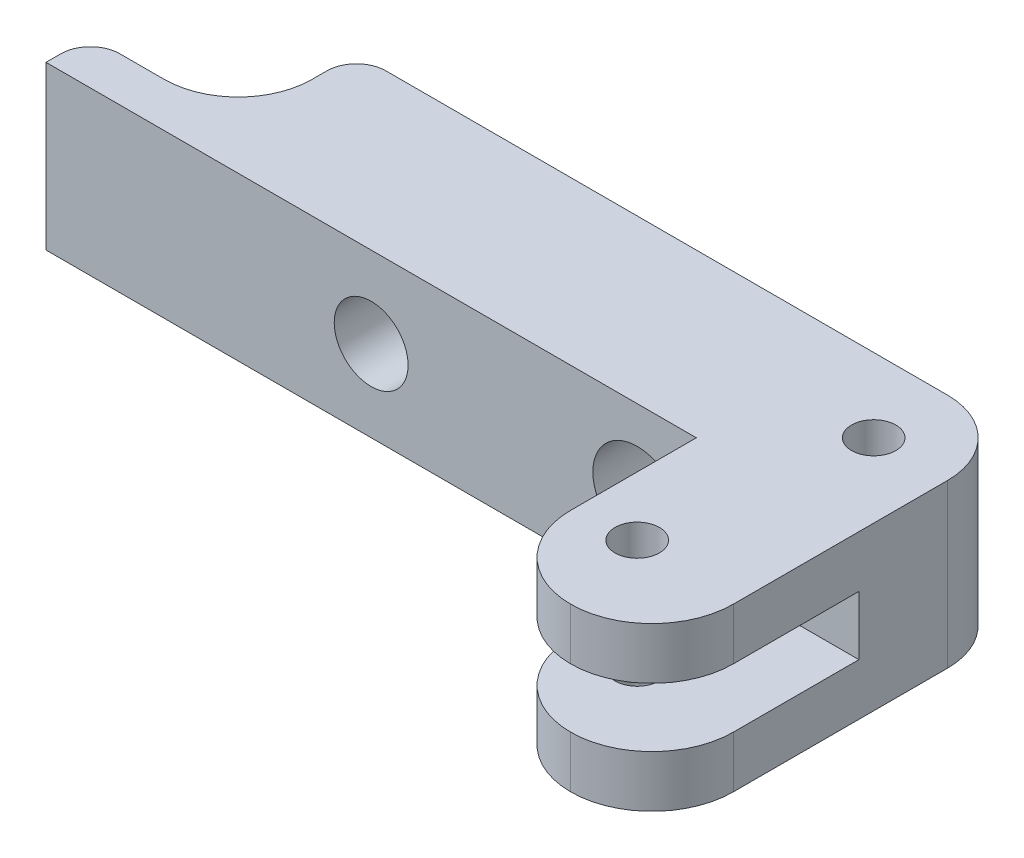
ISO-10303-21;
HEADER;
FILE_DESCRIPTION(('STEP AP214'),'2;1');
FILE_NAME('part.step','',(''),(''),'','','');
FILE_SCHEMA(('AUTOMOTIVE_DESIGN { 1 0 10303 214 1 1 1 1 }'));
ENDSEC;
DATA;
#1=APPLICATION_CONTEXT('core data for automotive mechanical design processes');
#2=APPLICATION_PROTOCOL_DEFINITION('international standard','automotive_design',2000,#1);
#3=PRODUCT_CONTEXT('',#1,'mechanical');
#4=PRODUCT('Part','Part','',(#3));
#5=PRODUCT_RELATED_PRODUCT_CATEGORY('part','',(#4));
#6=PRODUCT_DEFINITION_FORMATION('','',#4);
#7=PRODUCT_DEFINITION_CONTEXT('part definition',#1,'design');
#8=PRODUCT_DEFINITION('design','',#6,#7);
#9=PRODUCT_DEFINITION_SHAPE('','',#8);
#10=(LENGTH_UNIT() NAMED_UNIT(*) SI_UNIT(.MILLI.,.METRE.));
#11=(NAMED_UNIT(*) PLANE_ANGLE_UNIT() SI_UNIT($,.RADIAN.));
#12=(NAMED_UNIT(*) SI_UNIT($,.STERADIAN.) SOLID_ANGLE_UNIT());
#13=UNCERTAINTY_MEASURE_WITH_UNIT(LENGTH_MEASURE(1.E-05),#10,'distance_accuracy_value','');
#14=(GEOMETRIC_REPRESENTATION_CONTEXT(3) GLOBAL_UNCERTAINTY_ASSIGNED_CONTEXT((#13)) GLOBAL_UNIT_ASSIGNED_CONTEXT((#10,
#11,#12)) REPRESENTATION_CONTEXT('',''));
#15=CARTESIAN_POINT('',(0.,0.,0.));
#16=DIRECTION('',(0.,0.,1.));
#17=DIRECTION('',(1.,0.,0.));
#18=AXIS2_PLACEMENT_3D('',#15,#16,#17);
#19=CARTESIAN_POINT('',(49.5,11.,8.5));
#20=DIRECTION('',(0.,-1.,0.));
#21=DIRECTION('',(0.,0.,-1.));
#22=AXIS2_PLACEMENT_3D('',#19,#20,#21);
#23=CYLINDRICAL_SURFACE('',#22,5.5);
#24=CARTESIAN_POINT('',(49.5,7.5,8.5));
#25=DIRECTION('',(0.,1.,0.));
#26=DIRECTION('',(0.,0.,1.));
#27=AXIS2_PLACEMENT_3D('',#24,#25,#26);
#28=CIRCLE('',#27,5.5);
#29=CARTESIAN_POINT('',(55.,7.5,8.5));
#30=VERTEX_POINT('',#29);
#31=CARTESIAN_POINT('',(49.5,7.5,14.));
#32=VERTEX_POINT('',#31);
#33=EDGE_CURVE('E193',#30,#32,#28,.F.);
#34=ORIENTED_EDGE('',*,*,#33,.F.);
#35=DIRECTION('',(0.,-1.,0.));
#36=VECTOR('',#35,1.);
#37=CARTESIAN_POINT('',(55.,11.,8.5));
#38=LINE('',#37,#36);
#39=CARTESIAN_POINT('',(55.,11.,8.5));
#40=VERTEX_POINT('',#39);
#41=EDGE_CURVE('E289',#40,#30,#38,.T.);
#42=ORIENTED_EDGE('',*,*,#41,.F.);
#43=CARTESIAN_POINT('',(49.5,11.,8.5));
#44=DIRECTION('',(0.,-1.,0.));
#45=DIRECTION('',(0.,0.,-1.));
#46=AXIS2_PLACEMENT_3D('',#43,#44,#45);
#47=CIRCLE('',#46,5.5);
#48=CARTESIAN_POINT('',(49.5,11.,14.));
#49=VERTEX_POINT('',#48);
#50=EDGE_CURVE('E58',#49,#40,#47,.F.);
#51=ORIENTED_EDGE('',*,*,#50,.F.);
#52=DIRECTION('',(0.,1.,0.));
#53=VECTOR('',#52,1.);
#54=CARTESIAN_POINT('',(49.5,11.,14.));
#55=LINE('',#54,#53);
#56=EDGE_CURVE('E281',#49,#32,#55,.F.);
#57=ORIENTED_EDGE('',*,*,#56,.T.);
#58=EDGE_LOOP('',(#34,#42,#51,#57));
#59=FACE_BOUND('',#58,.T.);
#60=ADVANCED_FACE('F33',(#59),#23,.T.);
#61=CARTESIAN_POINT('',(49.5,11.,8.5));
#62=DIRECTION('',(0.,1.,0.));
#63=DIRECTION('',(0.,0.,1.));
#64=AXIS2_PLACEMENT_3D('',#61,#62,#63);
#65=CYLINDRICAL_SURFACE('',#64,5.5);
#66=CARTESIAN_POINT('',(49.5,7.5,8.5));
#67=DIRECTION('',(0.,1.,0.));
#68=DIRECTION('',(0.,0.,1.));
#69=AXIS2_PLACEMENT_3D('',#66,#67,#68);
#70=CIRCLE('',#69,5.5);
#71=CARTESIAN_POINT('',(44.,7.5,8.5));
#72=VERTEX_POINT('',#71);
#73=EDGE_CURVE('E191',#32,#72,#70,.F.);
#74=ORIENTED_EDGE('',*,*,#73,.F.);
#75=ORIENTED_EDGE('',*,*,#56,.F.);
#76=CARTESIAN_POINT('',(49.5,11.,8.5));
#77=DIRECTION('',(0.,-1.,0.));
#78=DIRECTION('',(0.,0.,-1.));
#79=AXIS2_PLACEMENT_3D('',#76,#77,#78);
#80=CIRCLE('',#79,5.5);
#81=CARTESIAN_POINT('',(44.,11.,8.5));
#82=VERTEX_POINT('',#81);
#83=EDGE_CURVE('E286',#82,#49,#80,.F.);
#84=ORIENTED_EDGE('',*,*,#83,.F.);
#85=DIRECTION('',(0.,1.,0.));
#86=VECTOR('',#85,1.);
#87=CARTESIAN_POINT('',(44.,11.,8.5));
#88=LINE('',#87,#86);
#89=EDGE_CURVE('E276',#72,#82,#88,.T.);
#90=ORIENTED_EDGE('',*,*,#89,.F.);
#91=EDGE_LOOP('',(#74,#75,#84,#90));
#92=FACE_BOUND('',#91,.T.);
#93=ADVANCED_FACE('F393',(#92),#65,.T.);
#94=CARTESIAN_POINT('',(44.,11.,14.));
#95=DIRECTION('',(1.,0.,0.));
#96=DIRECTION('',(0.,0.,-1.));
#97=AXIS2_PLACEMENT_3D('',#94,#95,#96);
#98=PLANE('',#97);
#99=DIRECTION('',(0.,-1.,0.));
#100=VECTOR('',#99,1.);
#101=CARTESIAN_POINT('',(44.,11.,0.));
#102=LINE('',#101,#100);
#103=CARTESIAN_POINT('',(44.,11.,0.));
#104=VERTEX_POINT('',#103);
#105=CARTESIAN_POINT('',(44.,7.5,0.));
#106=VERTEX_POINT('',#105);
#107=EDGE_CURVE('E229',#104,#106,#102,.T.);
#108=ORIENTED_EDGE('',*,*,#107,.T.);
#109=DIRECTION('',(0.,0.,-1.));
#110=VECTOR('',#109,1.);
#111=CARTESIAN_POINT('',(44.,7.5,0.));
#112=LINE('',#111,#110);
#113=EDGE_CURVE('E178',#72,#106,#112,.T.);
#114=ORIENTED_EDGE('',*,*,#113,.F.);
#115=ORIENTED_EDGE('',*,*,#89,.T.);
#116=DIRECTION('',(0.,0.,1.));
#117=VECTOR('',#116,1.);
#118=CARTESIAN_POINT('',(44.,11.,14.));
#119=LINE('',#118,#117);
#120=EDGE_CURVE('E199',#104,#82,#119,.T.);
#121=ORIENTED_EDGE('',*,*,#120,.F.);
#122=EDGE_LOOP('',(#108,#114,#115,#121));
#123=FACE_BOUND('',#122,.T.);
#124=ADVANCED_FACE('F396',(#123),#98,.F.);
#125=CARTESIAN_POINT('',(49.5,3.5,8.5));
#126=DIRECTION('',(0.,-1.,0.));
#127=DIRECTION('',(0.,0.,-1.));
#128=AXIS2_PLACEMENT_3D('',#125,#126,#127);
#129=CIRCLE('',#128,5.5);
#130=CARTESIAN_POINT('',(49.5,3.5,14.));
#131=VERTEX_POINT('',#130);
#132=CARTESIAN_POINT('',(55.,3.5,8.5));
#133=VERTEX_POINT('',#132);
#134=EDGE_CURVE('E50',#131,#133,#129,.F.);
#135=ORIENTED_EDGE('',*,*,#134,.F.);
#136=CARTESIAN_POINT('',(49.5,0.,14.));
#137=VERTEX_POINT('',#136);
#138=EDGE_CURVE('E280',#131,#137,#55,.F.);
#139=ORIENTED_EDGE('',*,*,#138,.T.);
#140=CARTESIAN_POINT('',(49.5,0.,8.5));
#141=DIRECTION('',(0.,-1.,0.));
#142=DIRECTION('',(0.,0.,-1.));
#143=AXIS2_PLACEMENT_3D('',#140,#141,#142);
#144=CIRCLE('',#143,5.5);
#145=CARTESIAN_POINT('',(55.,0.,8.5));
#146=VERTEX_POINT('',#145);
#147=EDGE_CURVE('E42',#146,#137,#144,.T.);
#148=ORIENTED_EDGE('',*,*,#147,.F.);
#149=EDGE_CURVE('E288',#133,#146,#38,.T.);
#150=ORIENTED_EDGE('',*,*,#149,.F.);
#151=EDGE_LOOP('',(#135,#139,#148,#150));
#152=FACE_BOUND('',#151,.T.);
#153=ADVANCED_FACE('F35',(#152),#23,.T.);
#154=CARTESIAN_POINT('',(49.5,3.5,8.5));
#155=DIRECTION('',(0.,-1.,0.));
#156=DIRECTION('',(0.,0.,-1.));
#157=AXIS2_PLACEMENT_3D('',#154,#155,#156);
#158=CIRCLE('',#157,5.5);
#159=CARTESIAN_POINT('',(44.,3.5,8.5));
#160=VERTEX_POINT('',#159);
#161=EDGE_CURVE('E187',#160,#131,#158,.F.);
#162=ORIENTED_EDGE('',*,*,#161,.F.);
#163=CARTESIAN_POINT('',(44.,0.,8.5));
#164=VERTEX_POINT('',#163);
#165=EDGE_CURVE('E277',#164,#160,#88,.T.);
#166=ORIENTED_EDGE('',*,*,#165,.F.);
#167=CARTESIAN_POINT('',(49.5,0.,8.5));
#168=DIRECTION('',(0.,-1.,0.));
#169=DIRECTION('',(0.,0.,-1.));
#170=AXIS2_PLACEMENT_3D('',#167,#168,#169);
#171=CIRCLE('',#170,5.5);
#172=EDGE_CURVE('E284',#137,#164,#171,.T.);
#173=ORIENTED_EDGE('',*,*,#172,.F.);
#174=ORIENTED_EDGE('',*,*,#138,.F.);
#175=EDGE_LOOP('',(#162,#166,#173,#174));
#176=FACE_BOUND('',#175,.T.);
#177=ADVANCED_FACE('F343',(#176),#65,.T.);
#178=CARTESIAN_POINT('',(50.,11.,-6.));
#179=DIRECTION('',(0.,-1.,0.));
#180=DIRECTION('',(0.,0.,-1.));
#181=AXIS2_PLACEMENT_3D('',#178,#179,#180);
#182=CYLINDRICAL_SURFACE('',#181,5.);
#183=DIRECTION('',(0.,-1.,0.));
#184=VECTOR('',#183,1.);
#185=CARTESIAN_POINT('',(50.,11.,-11.));
#186=LINE('',#185,#184);
#187=CARTESIAN_POINT('',(50.,11.,-11.));
#188=VERTEX_POINT('',#187);
#189=CARTESIAN_POINT('',(50.,0.,-11.));
#190=VERTEX_POINT('',#189);
#191=EDGE_CURVE('E265',#188,#190,#186,.T.);
#192=ORIENTED_EDGE('',*,*,#191,.F.);
#193=CARTESIAN_POINT('',(50.,11.,-6.));
#194=DIRECTION('',(0.,-1.,0.));
#195=DIRECTION('',(0.,0.,-1.));
#196=AXIS2_PLACEMENT_3D('',#193,#194,#195);
#197=CIRCLE('',#196,5.);
#198=CARTESIAN_POINT('',(55.,11.,-6.));
#199=VERTEX_POINT('',#198);
#200=EDGE_CURVE('E271',#199,#188,#197,.F.);
#201=ORIENTED_EDGE('',*,*,#200,.F.);
#202=DIRECTION('',(0.,-1.,0.));
#203=VECTOR('',#202,1.);
#204=CARTESIAN_POINT('',(55.,11.,-6.));
#205=LINE('',#204,#203);
#206=CARTESIAN_POINT('',(55.,0.,-6.));
#207=VERTEX_POINT('',#206);
#208=EDGE_CURVE('E268',#207,#199,#205,.F.);
#209=ORIENTED_EDGE('',*,*,#208,.F.);
#210=CARTESIAN_POINT('',(50.,0.,-6.));
#211=DIRECTION('',(0.,-1.,0.));
#212=DIRECTION('',(0.,0.,-1.));
#213=AXIS2_PLACEMENT_3D('',#210,#211,#212);
#214=CIRCLE('',#213,5.);
#215=EDGE_CURVE('E273',#190,#207,#214,.T.);
#216=ORIENTED_EDGE('',*,*,#215,.F.);
#217=EDGE_LOOP('',(#192,#201,#209,#216));
#218=FACE_BOUND('',#217,.T.);
#219=ADVANCED_FACE('F384',(#218),#182,.T.);
#220=CARTESIAN_POINT('',(12.,11.,-9.));
#221=DIRECTION('',(0.,-1.,0.));
#222=DIRECTION('',(0.,0.,-1.));
#223=AXIS2_PLACEMENT_3D('',#220,#221,#222);
#224=CYLINDRICAL_SURFACE('',#223,2.);
#225=DIRECTION('',(0.,-1.,0.));
#226=VECTOR('',#225,1.);
#227=CARTESIAN_POINT('',(10.,11.,-9.));
#228=LINE('',#227,#226);
#229=CARTESIAN_POINT('',(10.,11.,-9.));
#230=VERTEX_POINT('',#229);
#231=CARTESIAN_POINT('',(10.,0.,-9.));
#232=VERTEX_POINT('',#231);
#233=EDGE_CURVE('E254',#230,#232,#228,.T.);
#234=ORIENTED_EDGE('',*,*,#233,.F.);
#235=CARTESIAN_POINT('',(12.,11.,-9.));
#236=DIRECTION('',(0.,-1.,0.));
#237=DIRECTION('',(0.,0.,-1.));
#238=AXIS2_PLACEMENT_3D('',#235,#236,#237);
#239=CIRCLE('',#238,2.);
#240=CARTESIAN_POINT('',(12.,11.,-11.));
#241=VERTEX_POINT('',#240);
#242=EDGE_CURVE('E260',#241,#230,#239,.F.);
#243=ORIENTED_EDGE('',*,*,#242,.F.);
#244=DIRECTION('',(0.,-1.,0.));
#245=VECTOR('',#244,1.);
#246=CARTESIAN_POINT('',(12.,11.,-11.));
#247=LINE('',#246,#245);
#248=CARTESIAN_POINT('',(12.,0.,-11.));
#249=VERTEX_POINT('',#248);
#250=EDGE_CURVE('E257',#249,#241,#247,.F.);
#251=ORIENTED_EDGE('',*,*,#250,.F.);
#252=CARTESIAN_POINT('',(12.,0.,-9.));
#253=DIRECTION('',(0.,-1.,0.));
#254=DIRECTION('',(0.,0.,-1.));
#255=AXIS2_PLACEMENT_3D('',#252,#253,#254);
#256=CIRCLE('',#255,2.);
#257=EDGE_CURVE('E262',#232,#249,#256,.T.);
#258=ORIENTED_EDGE('',*,*,#257,.F.);
#259=EDGE_LOOP('',(#234,#243,#251,#258));
#260=FACE_BOUND('',#259,.T.);
#261=ADVANCED_FACE('F377',(#260),#224,.T.);
#262=CARTESIAN_POINT('',(5.,11.,-8.));
#263=DIRECTION('',(0.,1.,0.));
#264=DIRECTION('',(0.,0.,1.));
#265=AXIS2_PLACEMENT_3D('',#262,#263,#264);
#266=CYLINDRICAL_SURFACE('',#265,5.);
#267=DIRECTION('',(0.,-1.,0.));
#268=VECTOR('',#267,1.);
#269=CARTESIAN_POINT('',(5.,11.,-3.));
#270=LINE('',#269,#268);
#271=CARTESIAN_POINT('',(5.,11.,-3.));
#272=VERTEX_POINT('',#271);
#273=CARTESIAN_POINT('',(5.,0.,-3.));
#274=VERTEX_POINT('',#273);
#275=EDGE_CURVE('E243',#272,#274,#270,.T.);
#276=ORIENTED_EDGE('',*,*,#275,.F.);
#277=CARTESIAN_POINT('',(5.,11.,-8.));
#278=DIRECTION('',(0.,-1.,0.));
#279=DIRECTION('',(0.,0.,-1.));
#280=AXIS2_PLACEMENT_3D('',#277,#278,#279);
#281=CIRCLE('',#280,5.);
#282=CARTESIAN_POINT('',(10.,11.,-8.));
#283=VERTEX_POINT('',#282);
#284=EDGE_CURVE('E249',#272,#283,#281,.F.);
#285=ORIENTED_EDGE('',*,*,#284,.T.);
#286=DIRECTION('',(0.,-1.,0.));
#287=VECTOR('',#286,1.);
#288=CARTESIAN_POINT('',(10.,11.,-8.));
#289=LINE('',#288,#287);
#290=CARTESIAN_POINT('',(10.,0.,-8.));
#291=VERTEX_POINT('',#290);
#292=EDGE_CURVE('E246',#291,#283,#289,.F.);
#293=ORIENTED_EDGE('',*,*,#292,.F.);
#294=CARTESIAN_POINT('',(5.,0.,-8.));
#295=DIRECTION('',(0.,-1.,0.));
#296=DIRECTION('',(0.,0.,-1.));
#297=AXIS2_PLACEMENT_3D('',#294,#295,#296);
#298=CIRCLE('',#297,5.);
#299=EDGE_CURVE('E252',#291,#274,#298,.T.);
#300=ORIENTED_EDGE('',*,*,#299,.T.);
#301=EDGE_LOOP('',(#276,#285,#293,#300));
#302=FACE_BOUND('',#301,.T.);
#303=ADVANCED_FACE('F367',(#302),#266,.F.);
#304=CARTESIAN_POINT('',(2.,11.,-1.));
#305=DIRECTION('',(0.,-1.,0.));
#306=DIRECTION('',(0.,0.,-1.));
#307=AXIS2_PLACEMENT_3D('',#304,#305,#306);
#308=CYLINDRICAL_SURFACE('',#307,2.);
#309=DIRECTION('',(0.,-1.,0.));
#310=VECTOR('',#309,1.);
#311=CARTESIAN_POINT('',(0.,11.,-1.));
#312=LINE('',#311,#310);
#313=CARTESIAN_POINT('',(0.,11.,-1.));
#314=VERTEX_POINT('',#313);
#315=CARTESIAN_POINT('',(0.,0.,-1.));
#316=VERTEX_POINT('',#315);
#317=EDGE_CURVE('E232',#314,#316,#312,.T.);
#318=ORIENTED_EDGE('',*,*,#317,.F.);
#319=CARTESIAN_POINT('',(2.,11.,-1.));
#320=DIRECTION('',(0.,-1.,0.));
#321=DIRECTION('',(0.,0.,-1.));
#322=AXIS2_PLACEMENT_3D('',#319,#320,#321);
#323=CIRCLE('',#322,2.);
#324=CARTESIAN_POINT('',(2.,11.,-3.));
#325=VERTEX_POINT('',#324);
#326=EDGE_CURVE('E238',#325,#314,#323,.F.);
#327=ORIENTED_EDGE('',*,*,#326,.F.);
#328=DIRECTION('',(0.,-1.,0.));
#329=VECTOR('',#328,1.);
#330=CARTESIAN_POINT('',(2.,11.,-3.));
#331=LINE('',#330,#329);
#332=CARTESIAN_POINT('',(2.,0.,-3.));
#333=VERTEX_POINT('',#332);
#334=EDGE_CURVE('E235',#333,#325,#331,.F.);
#335=ORIENTED_EDGE('',*,*,#334,.F.);
#336=CARTESIAN_POINT('',(2.,0.,-1.));
#337=DIRECTION('',(0.,-1.,0.));
#338=DIRECTION('',(0.,0.,-1.));
#339=AXIS2_PLACEMENT_3D('',#336,#337,#338);
#340=CIRCLE('',#339,2.);
#341=EDGE_CURVE('E240',#316,#333,#340,.T.);
#342=ORIENTED_EDGE('',*,*,#341,.F.);
#343=EDGE_LOOP('',(#318,#327,#335,#342));
#344=FACE_BOUND('',#343,.T.);
#345=ADVANCED_FACE('F361',(#344),#308,.T.);
#346=CARTESIAN_POINT('',(44.,11.,0.));
#347=DIRECTION('',(0.,0.,-1.));
#348=DIRECTION('',(-1.,0.,0.));
#349=AXIS2_PLACEMENT_3D('',#346,#347,#348);
#350=PLANE('',#349);
#351=CARTESIAN_POINT('',(22.,5.5,0.));
#352=DIRECTION('',(0.,0.,-1.));
#353=DIRECTION('',(-1.,0.,0.));
#354=AXIS2_PLACEMENT_3D('',#351,#352,#353);
#355=CIRCLE('',#354,2.5);
#356=CARTESIAN_POINT('',(19.5,5.5,0.));
#357=VERTEX_POINT('',#356);
#358=EDGE_CURVE('E312',#357,#357,#355,.T.);
#359=ORIENTED_EDGE('',*,*,#358,.T.);
#360=EDGE_LOOP('',(#359));
#361=FACE_BOUND('',#360,.T.);
#362=CARTESIAN_POINT('',(40.,5.5,0.));
#363=DIRECTION('',(0.,0.,-1.));
#364=DIRECTION('',(-1.,0.,0.));
#365=AXIS2_PLACEMENT_3D('',#362,#363,#364);
#366=CIRCLE('',#365,3.);
#367=CARTESIAN_POINT('',(37.,5.5,0.));
#368=VERTEX_POINT('',#367);
#369=EDGE_CURVE('E305',#368,#368,#366,.T.);
#370=ORIENTED_EDGE('',*,*,#369,.T.);
#371=EDGE_LOOP('',(#370));
#372=FACE_BOUND('',#371,.T.);
#373=DIRECTION('',(1.,0.,0.));
#374=VECTOR('',#373,1.);
#375=CARTESIAN_POINT('',(44.,0.,0.));
#376=LINE('',#375,#374);
#377=CARTESIAN_POINT('',(0.,0.,0.));
#378=VERTEX_POINT('',#377);
#379=CARTESIAN_POINT('',(44.,0.,0.));
#380=VERTEX_POINT('',#379);
#381=EDGE_CURVE('E195',#378,#380,#376,.T.);
#382=ORIENTED_EDGE('',*,*,#381,.T.);
#383=CARTESIAN_POINT('',(44.,3.5,0.));
#384=VERTEX_POINT('',#383);
#385=EDGE_CURVE('E167',#384,#380,#102,.T.);
#386=ORIENTED_EDGE('',*,*,#385,.F.);
#387=DIRECTION('',(-1.,0.,0.));
#388=VECTOR('',#387,1.);
#389=CARTESIAN_POINT('',(55.,3.5,0.));
#390=LINE('',#389,#388);
#391=CARTESIAN_POINT('',(55.,3.5,0.));
#392=VERTEX_POINT('',#391);
#393=EDGE_CURVE('E161',#392,#384,#390,.T.);
#394=ORIENTED_EDGE('',*,*,#393,.F.);
#395=DIRECTION('',(0.,-1.,0.));
#396=VECTOR('',#395,1.);
#397=CARTESIAN_POINT('',(55.,3.5,0.));
#398=LINE('',#397,#396);
#399=CARTESIAN_POINT('',(55.,7.5,0.));
#400=VERTEX_POINT('',#399);
#401=EDGE_CURVE('E166',#400,#392,#398,.T.);
#402=ORIENTED_EDGE('',*,*,#401,.F.);
#403=DIRECTION('',(-1.,0.,0.));
#404=VECTOR('',#403,1.);
#405=CARTESIAN_POINT('',(55.,7.5,0.));
#406=LINE('',#405,#404);
#407=EDGE_CURVE('E169',#400,#106,#406,.T.);
#408=ORIENTED_EDGE('',*,*,#407,.T.);
#409=ORIENTED_EDGE('',*,*,#107,.F.);
#410=DIRECTION('',(1.,0.,0.));
#411=VECTOR('',#410,1.);
#412=CARTESIAN_POINT('',(44.,11.,0.));
#413=LINE('',#412,#411);
#414=CARTESIAN_POINT('',(0.,11.,0.));
#415=VERTEX_POINT('',#414);
#416=EDGE_CURVE('E196',#415,#104,#413,.T.);
#417=ORIENTED_EDGE('',*,*,#416,.F.);
#418=DIRECTION('',(0.,-1.,0.));
#419=VECTOR('',#418,1.);
#420=CARTESIAN_POINT('',(0.,11.,0.));
#421=LINE('',#420,#419);
#422=EDGE_CURVE('E213',#415,#378,#421,.T.);
#423=ORIENTED_EDGE('',*,*,#422,.T.);
#424=EDGE_LOOP('',(#382,#386,#394,#402,#408,#409,#417,#423));
#425=FACE_BOUND('',#424,.T.);
#426=ADVANCED_FACE('F163',(#361,#372,#425),#350,.F.);
#427=ORIENTED_EDGE('',*,*,#165,.T.);
#428=DIRECTION('',(0.,0.,1.));
#429=VECTOR('',#428,1.);
#430=CARTESIAN_POINT('',(44.,3.5,0.));
#431=LINE('',#430,#429);
#432=EDGE_CURVE('E180',#384,#160,#431,.T.);
#433=ORIENTED_EDGE('',*,*,#432,.F.);
#434=ORIENTED_EDGE('',*,*,#385,.T.);
#435=DIRECTION('',(0.,0.,1.));
#436=VECTOR('',#435,1.);
#437=CARTESIAN_POINT('',(44.,0.,14.));
#438=LINE('',#437,#436);
#439=EDGE_CURVE('E215',#380,#164,#438,.T.);
#440=ORIENTED_EDGE('',*,*,#439,.T.);
#441=EDGE_LOOP('',(#427,#433,#434,#440));
#442=FACE_BOUND('',#441,.T.);
#443=ADVANCED_FACE('F399',(#442),#98,.F.);
#444=CARTESIAN_POINT('',(55.,11.,-11.));
#445=DIRECTION('',(-1.,0.,0.));
#446=DIRECTION('',(0.,0.,1.));
#447=AXIS2_PLACEMENT_3D('',#444,#445,#446);
#448=PLANE('',#447);
#449=ORIENTED_EDGE('',*,*,#41,.T.);
#450=DIRECTION('',(0.,0.,-1.));
#451=VECTOR('',#450,1.);
#452=CARTESIAN_POINT('',(55.,7.5,-11.));
#453=LINE('',#452,#451);
#454=EDGE_CURVE('E11',#30,#400,#453,.T.);
#455=ORIENTED_EDGE('',*,*,#454,.T.);
#456=ORIENTED_EDGE('',*,*,#401,.T.);
#457=DIRECTION('',(0.,0.,1.));
#458=VECTOR('',#457,1.);
#459=CARTESIAN_POINT('',(55.,3.5,0.));
#460=LINE('',#459,#458);
#461=EDGE_CURVE('E170',#392,#133,#460,.T.);
#462=ORIENTED_EDGE('',*,*,#461,.T.);
#463=ORIENTED_EDGE('',*,*,#149,.T.);
#464=DIRECTION('',(0.,0.,-1.));
#465=VECTOR('',#464,1.);
#466=CARTESIAN_POINT('',(55.,0.,-11.));
#467=LINE('',#466,#465);
#468=EDGE_CURVE('E218',#146,#207,#467,.T.);
#469=ORIENTED_EDGE('',*,*,#468,.T.);
#470=ORIENTED_EDGE('',*,*,#208,.T.);
#471=DIRECTION('',(0.,0.,-1.));
#472=VECTOR('',#471,1.);
#473=CARTESIAN_POINT('',(55.,11.,-11.));
#474=LINE('',#473,#472);
#475=EDGE_CURVE('E203',#40,#199,#474,.T.);
#476=ORIENTED_EDGE('',*,*,#475,.F.);
#477=EDGE_LOOP('',(#449,#455,#456,#462,#463,#469,#470,#476));
#478=FACE_BOUND('',#477,.T.);
#479=ADVANCED_FACE('F177',(#478),#448,.F.);
#480=CARTESIAN_POINT('',(10.,11.,-11.));
#481=DIRECTION('',(0.,0.,1.));
#482=DIRECTION('',(1.,0.,0.));
#483=AXIS2_PLACEMENT_3D('',#480,#481,#482);
#484=PLANE('',#483);
#485=CARTESIAN_POINT('',(22.,5.5,-11.));
#486=DIRECTION('',(0.,0.,-1.));
#487=DIRECTION('',(-1.,0.,0.));
#488=AXIS2_PLACEMENT_3D('',#485,#486,#487);
#489=CIRCLE('',#488,2.5);
#490=CARTESIAN_POINT('',(19.5,5.5,-11.));
#491=VERTEX_POINT('',#490);
#492=EDGE_CURVE('E315',#491,#491,#489,.T.);
#493=ORIENTED_EDGE('',*,*,#492,.F.);
#494=EDGE_LOOP('',(#493));
#495=FACE_BOUND('',#494,.T.);
#496=CARTESIAN_POINT('',(40.,5.5,-11.));
#497=DIRECTION('',(0.,0.,-1.));
#498=DIRECTION('',(-1.,0.,0.));
#499=AXIS2_PLACEMENT_3D('',#496,#497,#498);
#500=CIRCLE('',#499,3.);
#501=CARTESIAN_POINT('',(37.,5.5,-11.));
#502=VERTEX_POINT('',#501);
#503=EDGE_CURVE('E309',#502,#502,#500,.T.);
#504=ORIENTED_EDGE('',*,*,#503,.F.);
#505=EDGE_LOOP('',(#504));
#506=FACE_BOUND('',#505,.T.);
#507=DIRECTION('',(-1.,0.,0.));
#508=VECTOR('',#507,1.);
#509=CARTESIAN_POINT('',(10.,11.,-11.));
#510=LINE('',#509,#508);
#511=EDGE_CURVE('E205',#188,#241,#510,.T.);
#512=ORIENTED_EDGE('',*,*,#511,.F.);
#513=ORIENTED_EDGE('',*,*,#191,.T.);
#514=DIRECTION('',(-1.,0.,0.));
#515=VECTOR('',#514,1.);
#516=CARTESIAN_POINT('',(10.,0.,-11.));
#517=LINE('',#516,#515);
#518=EDGE_CURVE('E220',#190,#249,#517,.T.);
#519=ORIENTED_EDGE('',*,*,#518,.T.);
#520=ORIENTED_EDGE('',*,*,#250,.T.);
#521=EDGE_LOOP('',(#512,#513,#519,#520));
#522=FACE_BOUND('',#521,.T.);
#523=ADVANCED_FACE('F380',(#495,#506,#522),#484,.F.);
#524=CARTESIAN_POINT('',(10.,11.,-3.));
#525=DIRECTION('',(1.,0.,0.));
#526=DIRECTION('',(0.,0.,-1.));
#527=AXIS2_PLACEMENT_3D('',#524,#525,#526);
#528=PLANE('',#527);
#529=DIRECTION('',(0.,0.,1.));
#530=VECTOR('',#529,1.);
#531=CARTESIAN_POINT('',(10.,11.,-3.));
#532=LINE('',#531,#530);
#533=EDGE_CURVE('E207',#230,#283,#532,.T.);
#534=ORIENTED_EDGE('',*,*,#533,.F.);
#535=ORIENTED_EDGE('',*,*,#233,.T.);
#536=DIRECTION('',(0.,0.,1.));
#537=VECTOR('',#536,1.);
#538=CARTESIAN_POINT('',(10.,0.,-3.));
#539=LINE('',#538,#537);
#540=EDGE_CURVE('E222',#232,#291,#539,.T.);
#541=ORIENTED_EDGE('',*,*,#540,.T.);
#542=ORIENTED_EDGE('',*,*,#292,.T.);
#543=EDGE_LOOP('',(#534,#535,#541,#542));
#544=FACE_BOUND('',#543,.T.);
#545=ADVANCED_FACE('F373',(#544),#528,.F.);
#546=CARTESIAN_POINT('',(0.,11.,-3.));
#547=DIRECTION('',(0.,0.,1.));
#548=DIRECTION('',(1.,0.,0.));
#549=AXIS2_PLACEMENT_3D('',#546,#547,#548);
#550=PLANE('',#549);
#551=DIRECTION('',(-1.,0.,0.));
#552=VECTOR('',#551,1.);
#553=CARTESIAN_POINT('',(0.,11.,-3.));
#554=LINE('',#553,#552);
#555=EDGE_CURVE('E209',#272,#325,#554,.T.);
#556=ORIENTED_EDGE('',*,*,#555,.F.);
#557=ORIENTED_EDGE('',*,*,#275,.T.);
#558=DIRECTION('',(-1.,0.,0.));
#559=VECTOR('',#558,1.);
#560=CARTESIAN_POINT('',(0.,0.,-3.));
#561=LINE('',#560,#559);
#562=EDGE_CURVE('E224',#274,#333,#561,.T.);
#563=ORIENTED_EDGE('',*,*,#562,.T.);
#564=ORIENTED_EDGE('',*,*,#334,.T.);
#565=EDGE_LOOP('',(#556,#557,#563,#564));
#566=FACE_BOUND('',#565,.T.);
#567=ADVANCED_FACE('F364',(#566),#550,.F.);
#568=CARTESIAN_POINT('',(0.,11.,0.));
#569=DIRECTION('',(1.,0.,0.));
#570=DIRECTION('',(0.,0.,-1.));
#571=AXIS2_PLACEMENT_3D('',#568,#569,#570);
#572=PLANE('',#571);
#573=DIRECTION('',(0.,0.,1.));
#574=VECTOR('',#573,1.);
#575=CARTESIAN_POINT('',(0.,11.,0.));
#576=LINE('',#575,#574);
#577=EDGE_CURVE('E211',#314,#415,#576,.T.);
#578=ORIENTED_EDGE('',*,*,#577,.F.);
#579=ORIENTED_EDGE('',*,*,#317,.T.);
#580=DIRECTION('',(0.,0.,1.));
#581=VECTOR('',#580,1.);
#582=CARTESIAN_POINT('',(0.,0.,0.));
#583=LINE('',#582,#581);
#584=EDGE_CURVE('E200',#316,#378,#583,.T.);
#585=ORIENTED_EDGE('',*,*,#584,.T.);
#586=ORIENTED_EDGE('',*,*,#422,.F.);
#587=EDGE_LOOP('',(#578,#579,#585,#586));
#588=FACE_BOUND('',#587,.T.);
#589=ADVANCED_FACE('F354',(#588),#572,.F.);
#590=CARTESIAN_POINT('',(0.,11.,0.));
#591=DIRECTION('',(0.,-1.,0.));
#592=DIRECTION('',(0.,0.,-1.));
#593=AXIS2_PLACEMENT_3D('',#590,#591,#592);
#594=PLANE('',#593);
#595=CARTESIAN_POINT('',(49.9999999999995,11.,-5.99999999999978));
#596=DIRECTION('',(0.,1.,0.));
#597=DIRECTION('',(0.,0.,1.));
#598=AXIS2_PLACEMENT_3D('',#595,#596,#597);
#599=CIRCLE('',#598,1.5);
#600=CARTESIAN_POINT('',(49.9999999999995,11.,-4.49999999999977));
#601=VERTEX_POINT('',#600);
#602=EDGE_CURVE('E318',#601,#601,#599,.T.);
#603=ORIENTED_EDGE('',*,*,#602,.F.);
#604=EDGE_LOOP('',(#603));
#605=FACE_BOUND('',#604,.T.);
#606=CARTESIAN_POINT('',(48.,11.,8.));
#607=DIRECTION('',(0.,1.,0.));
#608=DIRECTION('',(0.,0.,1.));
#609=AXIS2_PLACEMENT_3D('',#606,#607,#608);
#610=CIRCLE('',#609,1.5);
#611=CARTESIAN_POINT('',(48.,11.,9.50000000000001));
#612=VERTEX_POINT('',#611);
#613=EDGE_CURVE('E300',#612,#612,#610,.T.);
#614=ORIENTED_EDGE('',*,*,#613,.F.);
#615=EDGE_LOOP('',(#614));
#616=FACE_BOUND('',#615,.T.);
#617=ORIENTED_EDGE('',*,*,#83,.T.);
#618=ORIENTED_EDGE('',*,*,#50,.T.);
#619=ORIENTED_EDGE('',*,*,#475,.T.);
#620=ORIENTED_EDGE('',*,*,#200,.T.);
#621=ORIENTED_EDGE('',*,*,#511,.T.);
#622=ORIENTED_EDGE('',*,*,#242,.T.);
#623=ORIENTED_EDGE('',*,*,#533,.T.);
#624=ORIENTED_EDGE('',*,*,#284,.F.);
#625=ORIENTED_EDGE('',*,*,#555,.T.);
#626=ORIENTED_EDGE('',*,*,#326,.T.);
#627=ORIENTED_EDGE('',*,*,#577,.T.);
#628=ORIENTED_EDGE('',*,*,#416,.T.);
#629=ORIENTED_EDGE('',*,*,#120,.T.);
#630=EDGE_LOOP('',(#617,#618,#619,#620,#621,#622,#623,#624,#625,#626,#627,#628,#629));
#631=FACE_BOUND('',#630,.T.);
#632=ADVANCED_FACE('F330',(#605,#616,#631),#594,.F.);
#633=CARTESIAN_POINT('',(0.,0.,0.));
#634=DIRECTION('',(0.,-1.,0.));
#635=DIRECTION('',(0.,0.,-1.));
#636=AXIS2_PLACEMENT_3D('',#633,#634,#635);
#637=PLANE('',#636);
#638=CARTESIAN_POINT('',(49.9999999999995,0.,-5.99999999999978));
#639=DIRECTION('',(0.,-1.,0.));
#640=DIRECTION('',(0.,0.,-1.));
#641=AXIS2_PLACEMENT_3D('',#638,#639,#640);
#642=CIRCLE('',#641,1.5);
#643=CARTESIAN_POINT('',(49.9999999999995,0.,-7.49999999999978));
#644=VERTEX_POINT('',#643);
#645=EDGE_CURVE('E37',#644,#644,#642,.T.);
#646=ORIENTED_EDGE('',*,*,#645,.F.);
#647=EDGE_LOOP('',(#646));
#648=FACE_BOUND('',#647,.T.);
#649=CARTESIAN_POINT('',(48.,0.,8.));
#650=DIRECTION('',(0.,1.,0.));
#651=DIRECTION('',(0.,0.,1.));
#652=AXIS2_PLACEMENT_3D('',#649,#650,#651);
#653=CIRCLE('',#652,1.5);
#654=CARTESIAN_POINT('',(48.,0.,9.50000000000001));
#655=VERTEX_POINT('',#654);
#656=EDGE_CURVE('E295',#655,#655,#653,.T.);
#657=ORIENTED_EDGE('',*,*,#656,.T.);
#658=EDGE_LOOP('',(#657));
#659=FACE_BOUND('',#658,.T.);
#660=ORIENTED_EDGE('',*,*,#468,.F.);
#661=ORIENTED_EDGE('',*,*,#147,.T.);
#662=ORIENTED_EDGE('',*,*,#172,.T.);
#663=ORIENTED_EDGE('',*,*,#439,.F.);
#664=ORIENTED_EDGE('',*,*,#381,.F.);
#665=ORIENTED_EDGE('',*,*,#584,.F.);
#666=ORIENTED_EDGE('',*,*,#341,.T.);
#667=ORIENTED_EDGE('',*,*,#562,.F.);
#668=ORIENTED_EDGE('',*,*,#299,.F.);
#669=ORIENTED_EDGE('',*,*,#540,.F.);
#670=ORIENTED_EDGE('',*,*,#257,.T.);
#671=ORIENTED_EDGE('',*,*,#518,.F.);
#672=ORIENTED_EDGE('',*,*,#215,.T.);
#673=EDGE_LOOP('',(#660,#661,#662,#663,#664,#665,#666,#667,#668,#669,#670,#671,#672));
#674=FACE_BOUND('',#673,.T.);
#675=ADVANCED_FACE('F327',(#648,#659,#674),#637,.T.);
#676=CARTESIAN_POINT('',(55.,7.5,0.));
#677=DIRECTION('',(0.,1.,0.));
#678=DIRECTION('',(0.,0.,1.));
#679=AXIS2_PLACEMENT_3D('',#676,#677,#678);
#680=PLANE('',#679);
#681=CARTESIAN_POINT('',(48.,7.5,8.));
#682=DIRECTION('',(0.,1.,0.));
#683=DIRECTION('',(0.,0.,1.));
#684=AXIS2_PLACEMENT_3D('',#681,#682,#683);
#685=CIRCLE('',#684,1.5);
#686=CARTESIAN_POINT('',(48.,7.5,9.50000000000001));
#687=VERTEX_POINT('',#686);
#688=EDGE_CURVE('E183',#687,#687,#685,.T.);
#689=ORIENTED_EDGE('',*,*,#688,.T.);
#690=EDGE_LOOP('',(#689));
#691=FACE_BOUND('',#690,.T.);
#692=ORIENTED_EDGE('',*,*,#33,.T.);
#693=ORIENTED_EDGE('',*,*,#73,.T.);
#694=ORIENTED_EDGE('',*,*,#113,.T.);
#695=ORIENTED_EDGE('',*,*,#407,.F.);
#696=ORIENTED_EDGE('',*,*,#454,.F.);
#697=EDGE_LOOP('',(#692,#693,#694,#695,#696));
#698=FACE_BOUND('',#697,.T.);
#699=ADVANCED_FACE('F329',(#691,#698),#680,.F.);
#700=CARTESIAN_POINT('',(55.,3.5,0.));
#701=DIRECTION('',(0.,-1.,0.));
#702=DIRECTION('',(0.,0.,-1.));
#703=AXIS2_PLACEMENT_3D('',#700,#701,#702);
#704=PLANE('',#703);
#705=CARTESIAN_POINT('',(48.,3.5,8.));
#706=DIRECTION('',(0.,-1.,0.));
#707=DIRECTION('',(0.,0.,-1.));
#708=AXIS2_PLACEMENT_3D('',#705,#706,#707);
#709=CIRCLE('',#708,1.5);
#710=CARTESIAN_POINT('',(48.,3.5,6.5));
#711=VERTEX_POINT('',#710);
#712=EDGE_CURVE('E293',#711,#711,#709,.T.);
#713=ORIENTED_EDGE('',*,*,#712,.T.);
#714=EDGE_LOOP('',(#713));
#715=FACE_BOUND('',#714,.T.);
#716=ORIENTED_EDGE('',*,*,#134,.T.);
#717=ORIENTED_EDGE('',*,*,#461,.F.);
#718=ORIENTED_EDGE('',*,*,#393,.T.);
#719=ORIENTED_EDGE('',*,*,#432,.T.);
#720=ORIENTED_EDGE('',*,*,#161,.T.);
#721=EDGE_LOOP('',(#716,#717,#718,#719,#720));
#722=FACE_BOUND('',#721,.T.);
#723=ADVANCED_FACE('F172',(#715,#722),#704,.F.);
#724=CARTESIAN_POINT('',(48.,0.,8.));
#725=DIRECTION('',(0.,1.,0.));
#726=DIRECTION('',(0.,0.,1.));
#727=AXIS2_PLACEMENT_3D('',#724,#725,#726);
#728=CYLINDRICAL_SURFACE('',#727,1.5);
#729=ORIENTED_EDGE('',*,*,#656,.F.);
#730=EDGE_LOOP('',(#729));
#731=FACE_BOUND('',#730,.T.);
#732=ORIENTED_EDGE('',*,*,#712,.F.);
#733=EDGE_LOOP('',(#732));
#734=FACE_BOUND('',#733,.T.);
#735=ADVANCED_FACE('F471',(#731,#734),#728,.F.);
#736=ORIENTED_EDGE('',*,*,#613,.T.);
#737=EDGE_LOOP('',(#736));
#738=FACE_BOUND('',#737,.T.);
#739=ORIENTED_EDGE('',*,*,#688,.F.);
#740=EDGE_LOOP('',(#739));
#741=FACE_BOUND('',#740,.T.);
#742=ADVANCED_FACE('F480',(#738,#741),#728,.F.);
#743=CARTESIAN_POINT('',(40.,5.5,20.));
#744=DIRECTION('',(0.,0.,-1.));
#745=DIRECTION('',(-1.,0.,0.));
#746=AXIS2_PLACEMENT_3D('',#743,#744,#745);
#747=CYLINDRICAL_SURFACE('',#746,3.);
#748=ORIENTED_EDGE('',*,*,#503,.T.);
#749=EDGE_LOOP('',(#748));
#750=FACE_BOUND('',#749,.T.);
#751=ORIENTED_EDGE('',*,*,#369,.F.);
#752=EDGE_LOOP('',(#751));
#753=FACE_BOUND('',#752,.T.);
#754=ADVANCED_FACE('F490',(#750,#753),#747,.F.);
#755=CARTESIAN_POINT('',(22.,5.5,20.));
#756=DIRECTION('',(0.,0.,-1.));
#757=DIRECTION('',(-1.,0.,0.));
#758=AXIS2_PLACEMENT_3D('',#755,#756,#757);
#759=CYLINDRICAL_SURFACE('',#758,2.5);
#760=ORIENTED_EDGE('',*,*,#492,.T.);
#761=EDGE_LOOP('',(#760));
#762=FACE_BOUND('',#761,.T.);
#763=ORIENTED_EDGE('',*,*,#358,.F.);
#764=EDGE_LOOP('',(#763));
#765=FACE_BOUND('',#764,.T.);
#766=ADVANCED_FACE('F499',(#762,#765),#759,.F.);
#767=CARTESIAN_POINT('',(49.9999999999995,-20.,-5.99999999999978));
#768=DIRECTION('',(0.,1.,0.));
#769=DIRECTION('',(0.,0.,1.));
#770=AXIS2_PLACEMENT_3D('',#767,#768,#769);
#771=CYLINDRICAL_SURFACE('',#770,1.5);
#772=ORIENTED_EDGE('',*,*,#645,.T.);
#773=EDGE_LOOP('',(#772));
#774=FACE_BOUND('',#773,.T.);
#775=ORIENTED_EDGE('',*,*,#602,.T.);
#776=EDGE_LOOP('',(#775));
#777=FACE_BOUND('',#776,.T.);
#778=ADVANCED_FACE('F325',(#774,#777),#771,.F.);
#779=CLOSED_SHELL('',(#60,#93,#124,#153,#177,#219,#261,#303,#345,#426,#443,#479,#523,#545,#567,
#589,#632,#675,#699,#723,#735,#742,#754,#766,#778));
#780=MANIFOLD_SOLID_BREP('B2',#779);
#781=ADVANCED_BREP_SHAPE_REPRESENTATION('',(#18,#780),#14);
#782=SHAPE_DEFINITION_REPRESENTATION(#9,#781);
ENDSEC;
END-ISO-10303-21;
